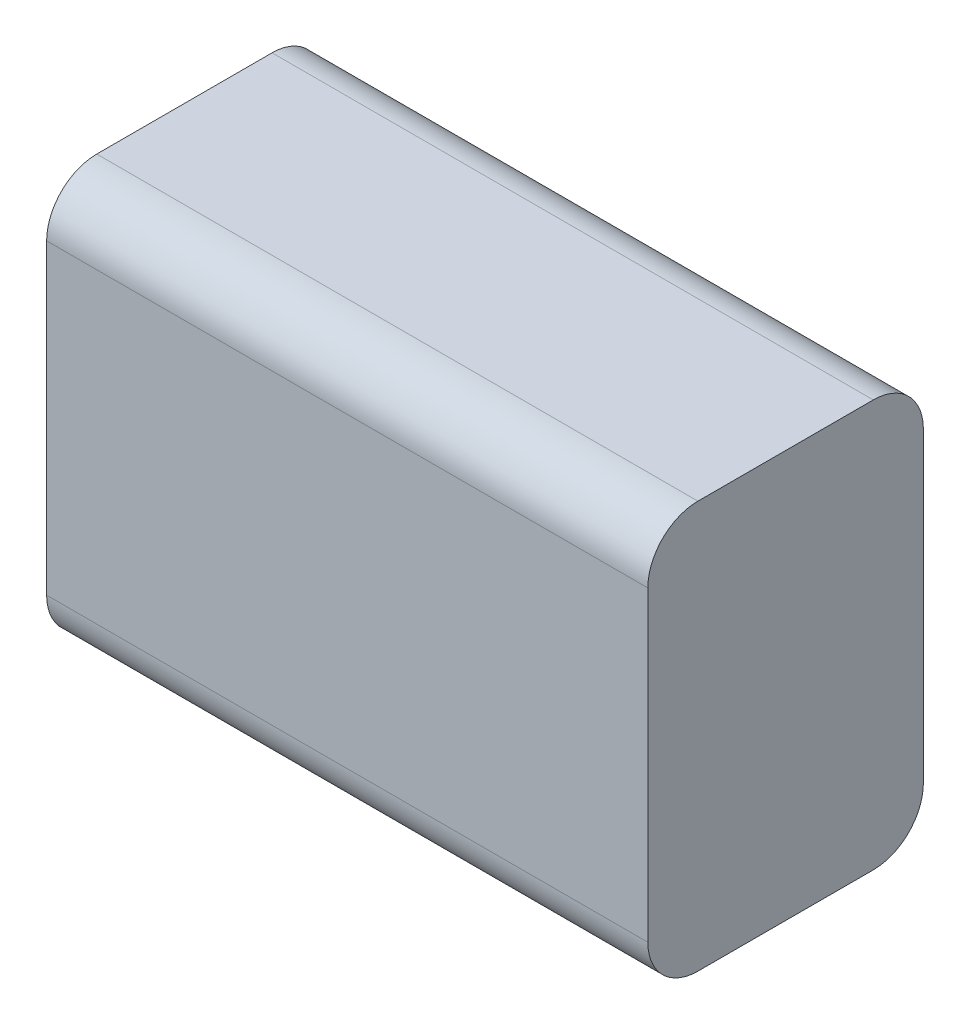
ISO-10303-21;
HEADER;
FILE_DESCRIPTION(('STEP AP214'),'2;1');
FILE_NAME('part.step','',(''),(''),'','','');
FILE_SCHEMA(('AUTOMOTIVE_DESIGN { 1 0 10303 214 1 1 1 1 }'));
ENDSEC;
DATA;
#1=APPLICATION_CONTEXT('core data for automotive mechanical design processes');
#2=APPLICATION_PROTOCOL_DEFINITION('international standard','automotive_design',2000,#1);
#3=PRODUCT_CONTEXT('',#1,'mechanical');
#4=PRODUCT('Part','Part','',(#3));
#5=PRODUCT_RELATED_PRODUCT_CATEGORY('part','',(#4));
#6=PRODUCT_DEFINITION_FORMATION('','',#4);
#7=PRODUCT_DEFINITION_CONTEXT('part definition',#1,'design');
#8=PRODUCT_DEFINITION('design','',#6,#7);
#9=PRODUCT_DEFINITION_SHAPE('','',#8);
#10=(LENGTH_UNIT() NAMED_UNIT(*) SI_UNIT(.MILLI.,.METRE.));
#11=(NAMED_UNIT(*) PLANE_ANGLE_UNIT() SI_UNIT($,.RADIAN.));
#12=(NAMED_UNIT(*) SI_UNIT($,.STERADIAN.) SOLID_ANGLE_UNIT());
#13=UNCERTAINTY_MEASURE_WITH_UNIT(LENGTH_MEASURE(1.E-05),#10,'distance_accuracy_value','');
#14=(GEOMETRIC_REPRESENTATION_CONTEXT(3) GLOBAL_UNCERTAINTY_ASSIGNED_CONTEXT((#13)) GLOBAL_UNIT_ASSIGNED_CONTEXT((#10,
#11,#12)) REPRESENTATION_CONTEXT('',''));
#15=CARTESIAN_POINT('',(0.,0.,0.));
#16=DIRECTION('',(0.,0.,1.));
#17=DIRECTION('',(1.,0.,0.));
#18=AXIS2_PLACEMENT_3D('',#15,#16,#17);
#19=CARTESIAN_POINT('',(24.,16.25,22.));
#20=DIRECTION('',(-1.,0.,0.));
#21=DIRECTION('',(0.,-1.,0.));
#22=AXIS2_PLACEMENT_3D('',#19,#20,#21);
#23=PLANE('',#22);
#24=DIRECTION('',(0.,0.,-1.));
#25=VECTOR('',#24,1.);
#26=CARTESIAN_POINT('',(24.,-16.25,22.));
#27=LINE('',#26,#25);
#28=CARTESIAN_POINT('',(24.,-16.25,18.));
#29=VERTEX_POINT('',#28);
#30=CARTESIAN_POINT('',(24.,-16.25,4.));
#31=VERTEX_POINT('',#30);
#32=EDGE_CURVE('E108',#29,#31,#27,.T.);
#33=ORIENTED_EDGE('',*,*,#32,.T.);
#34=CARTESIAN_POINT('',(24.,-12.25,4.));
#35=DIRECTION('',(-1.,0.,0.));
#36=DIRECTION('',(0.,-1.,0.));
#37=AXIS2_PLACEMENT_3D('',#34,#35,#36);
#38=CIRCLE('',#37,4.);
#39=CARTESIAN_POINT('',(24.,-12.25,0.));
#40=VERTEX_POINT('',#39);
#41=EDGE_CURVE('E116',#31,#40,#38,.F.);
#42=ORIENTED_EDGE('',*,*,#41,.T.);
#43=DIRECTION('',(0.,1.,0.));
#44=VECTOR('',#43,1.);
#45=CARTESIAN_POINT('',(24.,16.25,0.));
#46=LINE('',#45,#44);
#47=CARTESIAN_POINT('',(24.,12.25,0.));
#48=VERTEX_POINT('',#47);
#49=EDGE_CURVE('E194',#40,#48,#46,.T.);
#50=ORIENTED_EDGE('',*,*,#49,.T.);
#51=CARTESIAN_POINT('',(24.,12.25,4.));
#52=DIRECTION('',(-1.,0.,0.));
#53=DIRECTION('',(0.,-1.,0.));
#54=AXIS2_PLACEMENT_3D('',#51,#52,#53);
#55=CIRCLE('',#54,4.);
#56=CARTESIAN_POINT('',(24.,16.25,4.));
#57=VERTEX_POINT('',#56);
#58=EDGE_CURVE('E117',#48,#57,#55,.F.);
#59=ORIENTED_EDGE('',*,*,#58,.T.);
#60=DIRECTION('',(0.,0.,-1.));
#61=VECTOR('',#60,1.);
#62=CARTESIAN_POINT('',(24.,16.25,22.));
#63=LINE('',#62,#61);
#64=CARTESIAN_POINT('',(24.,16.25,18.));
#65=VERTEX_POINT('',#64);
#66=EDGE_CURVE('E135',#65,#57,#63,.T.);
#67=ORIENTED_EDGE('',*,*,#66,.F.);
#68=CARTESIAN_POINT('',(24.,12.25,18.));
#69=DIRECTION('',(-1.,0.,0.));
#70=DIRECTION('',(0.,-1.,0.));
#71=AXIS2_PLACEMENT_3D('',#68,#69,#70);
#72=CIRCLE('',#71,4.);
#73=CARTESIAN_POINT('',(24.,12.25,22.));
#74=VERTEX_POINT('',#73);
#75=EDGE_CURVE('E139',#65,#74,#72,.F.);
#76=ORIENTED_EDGE('',*,*,#75,.T.);
#77=DIRECTION('',(0.,1.,0.));
#78=VECTOR('',#77,1.);
#79=CARTESIAN_POINT('',(24.,16.25,22.));
#80=LINE('',#79,#78);
#81=CARTESIAN_POINT('',(24.,-12.25,22.));
#82=VERTEX_POINT('',#81);
#83=EDGE_CURVE('E110',#82,#74,#80,.T.);
#84=ORIENTED_EDGE('',*,*,#83,.F.);
#85=CARTESIAN_POINT('',(24.,-12.25,18.));
#86=DIRECTION('',(-1.,0.,0.));
#87=DIRECTION('',(0.,-1.,0.));
#88=AXIS2_PLACEMENT_3D('',#85,#86,#87);
#89=CIRCLE('',#88,4.);
#90=EDGE_CURVE('E106',#82,#29,#89,.F.);
#91=ORIENTED_EDGE('',*,*,#90,.T.);
#92=EDGE_LOOP('',(#33,#42,#50,#59,#67,#76,#84,#91));
#93=FACE_BOUND('',#92,.T.);
#94=ADVANCED_FACE('F39',(#93),#23,.F.);
#95=CARTESIAN_POINT('',(-24.,16.25,22.));
#96=DIRECTION('',(0.,-1.,0.));
#97=DIRECTION('',(0.,0.,-1.));
#98=AXIS2_PLACEMENT_3D('',#95,#96,#97);
#99=PLANE('',#98);
#100=ORIENTED_EDGE('',*,*,#66,.T.);
#101=DIRECTION('',(-1.,0.,0.));
#102=VECTOR('',#101,1.);
#103=CARTESIAN_POINT('',(-24.,16.25,4.));
#104=LINE('',#103,#102);
#105=CARTESIAN_POINT('',(-24.,16.25,4.));
#106=VERTEX_POINT('',#105);
#107=EDGE_CURVE('E11',#57,#106,#104,.T.);
#108=ORIENTED_EDGE('',*,*,#107,.T.);
#109=DIRECTION('',(0.,0.,-1.));
#110=VECTOR('',#109,1.);
#111=CARTESIAN_POINT('',(-24.,16.25,22.));
#112=LINE('',#111,#110);
#113=CARTESIAN_POINT('',(-24.,16.25,18.));
#114=VERTEX_POINT('',#113);
#115=EDGE_CURVE('E142',#114,#106,#112,.T.);
#116=ORIENTED_EDGE('',*,*,#115,.F.);
#117=DIRECTION('',(-1.,0.,0.));
#118=VECTOR('',#117,1.);
#119=CARTESIAN_POINT('',(24.,16.25,18.));
#120=LINE('',#119,#118);
#121=EDGE_CURVE('E48',#114,#65,#120,.F.);
#122=ORIENTED_EDGE('',*,*,#121,.T.);
#123=EDGE_LOOP('',(#100,#108,#116,#122));
#124=FACE_BOUND('',#123,.T.);
#125=ADVANCED_FACE('F177',(#124),#99,.F.);
#126=CARTESIAN_POINT('',(-24.,16.25,22.));
#127=DIRECTION('',(1.,0.,0.));
#128=DIRECTION('',(0.,1.,0.));
#129=AXIS2_PLACEMENT_3D('',#126,#127,#128);
#130=PLANE('',#129);
#131=DIRECTION('',(0.,-1.,0.));
#132=VECTOR('',#131,1.);
#133=CARTESIAN_POINT('',(-24.,16.25,0.));
#134=LINE('',#133,#132);
#135=CARTESIAN_POINT('',(-24.,12.25,0.));
#136=VERTEX_POINT('',#135);
#137=CARTESIAN_POINT('',(-24.,-12.25,0.));
#138=VERTEX_POINT('',#137);
#139=EDGE_CURVE('E191',#136,#138,#134,.T.);
#140=ORIENTED_EDGE('',*,*,#139,.T.);
#141=CARTESIAN_POINT('',(-24.,-12.25,4.));
#142=DIRECTION('',(1.,0.,0.));
#143=DIRECTION('',(0.,1.,0.));
#144=AXIS2_PLACEMENT_3D('',#141,#142,#143);
#145=CIRCLE('',#144,4.);
#146=CARTESIAN_POINT('',(-24.,-16.25,4.));
#147=VERTEX_POINT('',#146);
#148=EDGE_CURVE('E164',#138,#147,#145,.F.);
#149=ORIENTED_EDGE('',*,*,#148,.T.);
#150=DIRECTION('',(0.,0.,-1.));
#151=VECTOR('',#150,1.);
#152=CARTESIAN_POINT('',(-24.,-16.25,22.));
#153=LINE('',#152,#151);
#154=CARTESIAN_POINT('',(-24.,-16.25,18.));
#155=VERTEX_POINT('',#154);
#156=EDGE_CURVE('E128',#155,#147,#153,.T.);
#157=ORIENTED_EDGE('',*,*,#156,.F.);
#158=CARTESIAN_POINT('',(-24.,-12.25,18.));
#159=DIRECTION('',(1.,0.,0.));
#160=DIRECTION('',(0.,1.,0.));
#161=AXIS2_PLACEMENT_3D('',#158,#159,#160);
#162=CIRCLE('',#161,4.);
#163=CARTESIAN_POINT('',(-24.,-12.25,22.));
#164=VERTEX_POINT('',#163);
#165=EDGE_CURVE('E133',#155,#164,#162,.F.);
#166=ORIENTED_EDGE('',*,*,#165,.T.);
#167=DIRECTION('',(0.,-1.,0.));
#168=VECTOR('',#167,1.);
#169=CARTESIAN_POINT('',(-24.,16.25,22.));
#170=LINE('',#169,#168);
#171=CARTESIAN_POINT('',(-24.,12.25,22.));
#172=VERTEX_POINT('',#171);
#173=EDGE_CURVE('E129',#172,#164,#170,.T.);
#174=ORIENTED_EDGE('',*,*,#173,.F.);
#175=CARTESIAN_POINT('',(-24.,12.25,18.));
#176=DIRECTION('',(1.,0.,0.));
#177=DIRECTION('',(0.,1.,0.));
#178=AXIS2_PLACEMENT_3D('',#175,#176,#177);
#179=CIRCLE('',#178,4.);
#180=EDGE_CURVE('E62',#172,#114,#179,.F.);
#181=ORIENTED_EDGE('',*,*,#180,.T.);
#182=ORIENTED_EDGE('',*,*,#115,.T.);
#183=CARTESIAN_POINT('',(-24.,12.25,4.));
#184=DIRECTION('',(1.,0.,0.));
#185=DIRECTION('',(0.,1.,0.));
#186=AXIS2_PLACEMENT_3D('',#183,#184,#185);
#187=CIRCLE('',#186,4.);
#188=EDGE_CURVE('E55',#106,#136,#187,.F.);
#189=ORIENTED_EDGE('',*,*,#188,.T.);
#190=EDGE_LOOP('',(#140,#149,#157,#166,#174,#181,#182,#189));
#191=FACE_BOUND('',#190,.T.);
#192=ADVANCED_FACE('F187',(#191),#130,.F.);
#193=CARTESIAN_POINT('',(-24.,-16.25,22.));
#194=DIRECTION('',(0.,1.,0.));
#195=DIRECTION('',(0.,0.,1.));
#196=AXIS2_PLACEMENT_3D('',#193,#194,#195);
#197=PLANE('',#196);
#198=ORIENTED_EDGE('',*,*,#156,.T.);
#199=DIRECTION('',(1.,0.,0.));
#200=VECTOR('',#199,1.);
#201=CARTESIAN_POINT('',(-24.,-16.25,4.));
#202=LINE('',#201,#200);
#203=EDGE_CURVE('E126',#147,#31,#202,.T.);
#204=ORIENTED_EDGE('',*,*,#203,.T.);
#205=ORIENTED_EDGE('',*,*,#32,.F.);
#206=DIRECTION('',(1.,0.,0.));
#207=VECTOR('',#206,1.);
#208=CARTESIAN_POINT('',(-24.,-16.25,18.));
#209=LINE('',#208,#207);
#210=EDGE_CURVE('E123',#29,#155,#209,.F.);
#211=ORIENTED_EDGE('',*,*,#210,.T.);
#212=EDGE_LOOP('',(#198,#204,#205,#211));
#213=FACE_BOUND('',#212,.T.);
#214=ADVANCED_FACE('F122',(#213),#197,.F.);
#215=CARTESIAN_POINT('',(0.,0.,22.));
#216=DIRECTION('',(0.,0.,1.));
#217=DIRECTION('',(1.,0.,0.));
#218=AXIS2_PLACEMENT_3D('',#215,#216,#217);
#219=PLANE('',#218);
#220=ORIENTED_EDGE('',*,*,#173,.T.);
#221=DIRECTION('',(1.,0.,0.));
#222=VECTOR('',#221,1.);
#223=CARTESIAN_POINT('',(24.,-12.25,22.));
#224=LINE('',#223,#222);
#225=EDGE_CURVE('E171',#164,#82,#224,.T.);
#226=ORIENTED_EDGE('',*,*,#225,.T.);
#227=ORIENTED_EDGE('',*,*,#83,.T.);
#228=DIRECTION('',(-1.,0.,0.));
#229=VECTOR('',#228,1.);
#230=CARTESIAN_POINT('',(-24.,12.25,22.));
#231=LINE('',#230,#229);
#232=EDGE_CURVE('E167',#74,#172,#231,.T.);
#233=ORIENTED_EDGE('',*,*,#232,.T.);
#234=EDGE_LOOP('',(#220,#226,#227,#233));
#235=FACE_BOUND('',#234,.T.);
#236=ADVANCED_FACE('F185',(#235),#219,.T.);
#237=CARTESIAN_POINT('',(0.,0.,0.));
#238=DIRECTION('',(0.,0.,1.));
#239=DIRECTION('',(1.,0.,0.));
#240=AXIS2_PLACEMENT_3D('',#237,#238,#239);
#241=PLANE('',#240);
#242=ORIENTED_EDGE('',*,*,#49,.F.);
#243=DIRECTION('',(1.,0.,0.));
#244=VECTOR('',#243,1.);
#245=CARTESIAN_POINT('',(0.,-12.25,0.));
#246=LINE('',#245,#244);
#247=EDGE_CURVE('E155',#40,#138,#246,.F.);
#248=ORIENTED_EDGE('',*,*,#247,.T.);
#249=ORIENTED_EDGE('',*,*,#139,.F.);
#250=DIRECTION('',(-1.,0.,0.));
#251=VECTOR('',#250,1.);
#252=CARTESIAN_POINT('',(0.,12.25,0.));
#253=LINE('',#252,#251);
#254=EDGE_CURVE('E152',#136,#48,#253,.F.);
#255=ORIENTED_EDGE('',*,*,#254,.T.);
#256=EDGE_LOOP('',(#242,#248,#249,#255));
#257=FACE_BOUND('',#256,.T.);
#258=ADVANCED_FACE('F205',(#257),#241,.F.);
#259=CARTESIAN_POINT('',(-24.,-12.25,4.));
#260=DIRECTION('',(1.,0.,0.));
#261=DIRECTION('',(0.,0.,-1.));
#262=AXIS2_PLACEMENT_3D('',#259,#260,#261);
#263=CYLINDRICAL_SURFACE('',#262,4.);
#264=ORIENTED_EDGE('',*,*,#148,.F.);
#265=ORIENTED_EDGE('',*,*,#247,.F.);
#266=ORIENTED_EDGE('',*,*,#41,.F.);
#267=ORIENTED_EDGE('',*,*,#203,.F.);
#268=EDGE_LOOP('',(#264,#265,#266,#267));
#269=FACE_BOUND('',#268,.T.);
#270=ADVANCED_FACE('F213',(#269),#263,.T.);
#271=CARTESIAN_POINT('',(0.,-12.25,18.));
#272=DIRECTION('',(-1.,0.,0.));
#273=DIRECTION('',(0.,0.,1.));
#274=AXIS2_PLACEMENT_3D('',#271,#272,#273);
#275=CYLINDRICAL_SURFACE('',#274,4.);
#276=ORIENTED_EDGE('',*,*,#165,.F.);
#277=ORIENTED_EDGE('',*,*,#210,.F.);
#278=ORIENTED_EDGE('',*,*,#90,.F.);
#279=ORIENTED_EDGE('',*,*,#225,.F.);
#280=EDGE_LOOP('',(#276,#277,#278,#279));
#281=FACE_BOUND('',#280,.T.);
#282=ADVANCED_FACE('F132',(#281),#275,.T.);
#283=CARTESIAN_POINT('',(-24.,12.25,4.));
#284=DIRECTION('',(-1.,0.,0.));
#285=DIRECTION('',(0.,0.,1.));
#286=AXIS2_PLACEMENT_3D('',#283,#284,#285);
#287=CYLINDRICAL_SURFACE('',#286,4.);
#288=ORIENTED_EDGE('',*,*,#58,.F.);
#289=ORIENTED_EDGE('',*,*,#254,.F.);
#290=ORIENTED_EDGE('',*,*,#188,.F.);
#291=ORIENTED_EDGE('',*,*,#107,.F.);
#292=EDGE_LOOP('',(#288,#289,#290,#291));
#293=FACE_BOUND('',#292,.T.);
#294=ADVANCED_FACE('F207',(#293),#287,.T.);
#295=CARTESIAN_POINT('',(0.,12.25,18.));
#296=DIRECTION('',(1.,0.,0.));
#297=DIRECTION('',(0.,0.,-1.));
#298=AXIS2_PLACEMENT_3D('',#295,#296,#297);
#299=CYLINDRICAL_SURFACE('',#298,4.);
#300=ORIENTED_EDGE('',*,*,#75,.F.);
#301=ORIENTED_EDGE('',*,*,#121,.F.);
#302=ORIENTED_EDGE('',*,*,#180,.F.);
#303=ORIENTED_EDGE('',*,*,#232,.F.);
#304=EDGE_LOOP('',(#300,#301,#302,#303));
#305=FACE_BOUND('',#304,.T.);
#306=ADVANCED_FACE('F41',(#305),#299,.T.);
#307=CLOSED_SHELL('',(#94,#125,#192,#214,#236,#258,#270,#282,#294,#306));
#308=MANIFOLD_SOLID_BREP('B2',#307);
#309=ADVANCED_BREP_SHAPE_REPRESENTATION('',(#18,#308),#14);
#310=SHAPE_DEFINITION_REPRESENTATION(#9,#309);
ENDSEC;
END-ISO-10303-21;
